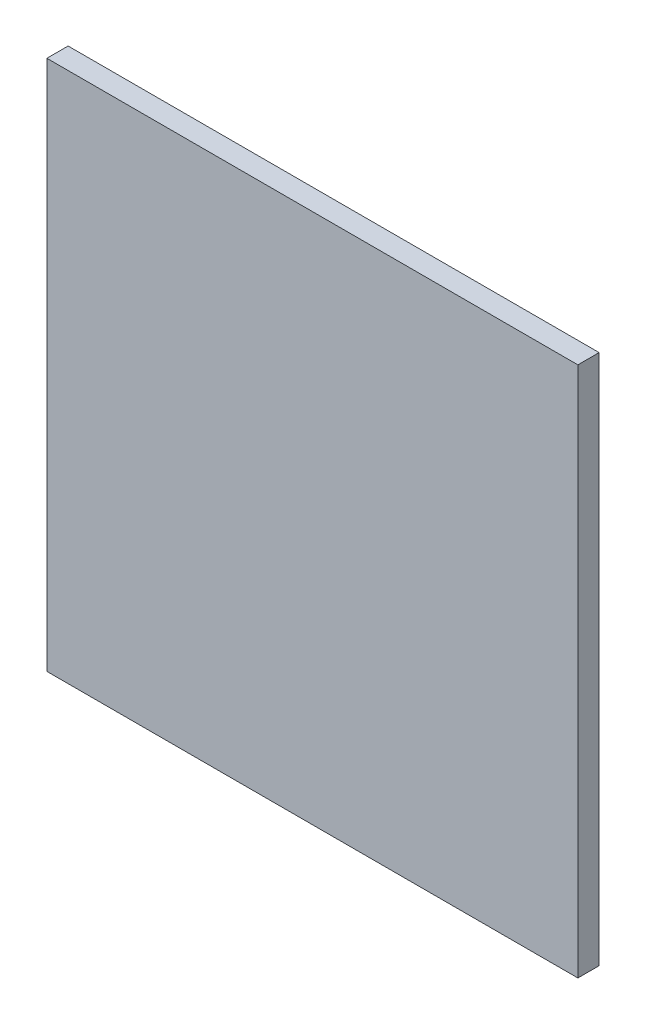
ISO-10303-21;
HEADER;
FILE_DESCRIPTION(('STEP AP214'),'2;1');
FILE_NAME('part.step','',(''),(''),'','','');
FILE_SCHEMA(('AUTOMOTIVE_DESIGN { 1 0 10303 214 1 1 1 1 }'));
ENDSEC;
DATA;
#1=APPLICATION_CONTEXT('core data for automotive mechanical design processes');
#2=APPLICATION_PROTOCOL_DEFINITION('international standard','automotive_design',2000,#1);
#3=PRODUCT_CONTEXT('',#1,'mechanical');
#4=PRODUCT('Part','Part','',(#3));
#5=PRODUCT_RELATED_PRODUCT_CATEGORY('part','',(#4));
#6=PRODUCT_DEFINITION_FORMATION('','',#4);
#7=PRODUCT_DEFINITION_CONTEXT('part definition',#1,'design');
#8=PRODUCT_DEFINITION('design','',#6,#7);
#9=PRODUCT_DEFINITION_SHAPE('','',#8);
#10=(LENGTH_UNIT() NAMED_UNIT(*) SI_UNIT(.MILLI.,.METRE.));
#11=(NAMED_UNIT(*) PLANE_ANGLE_UNIT() SI_UNIT($,.RADIAN.));
#12=(NAMED_UNIT(*) SI_UNIT($,.STERADIAN.) SOLID_ANGLE_UNIT());
#13=UNCERTAINTY_MEASURE_WITH_UNIT(LENGTH_MEASURE(1.E-05),#10,'distance_accuracy_value','');
#14=(GEOMETRIC_REPRESENTATION_CONTEXT(3) GLOBAL_UNCERTAINTY_ASSIGNED_CONTEXT((#13)) GLOBAL_UNIT_ASSIGNED_CONTEXT((#10,
#11,#12)) REPRESENTATION_CONTEXT('',''));
#15=CARTESIAN_POINT('',(0.,0.,0.));
#16=DIRECTION('',(0.,0.,1.));
#17=DIRECTION('',(1.,0.,0.));
#18=AXIS2_PLACEMENT_3D('',#15,#16,#17);
#19=CARTESIAN_POINT('',(0.,0.,1.016));
#20=DIRECTION('',(1.,0.,0.));
#21=DIRECTION('',(0.,1.,0.));
#22=AXIS2_PLACEMENT_3D('',#19,#20,#21);
#23=PLANE('',#22);
#24=DIRECTION('',(0.,-1.,0.));
#25=VECTOR('',#24,1.);
#26=CARTESIAN_POINT('',(0.,0.,0.));
#27=LINE('',#26,#25);
#28=CARTESIAN_POINT('',(0.,25.4,0.));
#29=VERTEX_POINT('',#28);
#30=CARTESIAN_POINT('',(0.,0.,0.));
#31=VERTEX_POINT('',#30);
#32=EDGE_CURVE('E97',#29,#31,#27,.T.);
#33=ORIENTED_EDGE('',*,*,#32,.T.);
#34=DIRECTION('',(0.,0.,-1.));
#35=VECTOR('',#34,1.);
#36=CARTESIAN_POINT('',(0.,0.,1.016));
#37=LINE('',#36,#35);
#38=CARTESIAN_POINT('',(0.,0.,1.016));
#39=VERTEX_POINT('',#38);
#40=EDGE_CURVE('E11',#39,#31,#37,.T.);
#41=ORIENTED_EDGE('',*,*,#40,.F.);
#42=DIRECTION('',(0.,-1.,0.));
#43=VECTOR('',#42,1.);
#44=CARTESIAN_POINT('',(0.,0.,1.016));
#45=LINE('',#44,#43);
#46=CARTESIAN_POINT('',(0.,25.4,1.016));
#47=VERTEX_POINT('',#46);
#48=EDGE_CURVE('E85',#47,#39,#45,.T.);
#49=ORIENTED_EDGE('',*,*,#48,.F.);
#50=DIRECTION('',(0.,0.,-1.));
#51=VECTOR('',#50,1.);
#52=CARTESIAN_POINT('',(0.,25.4,1.016));
#53=LINE('',#52,#51);
#54=EDGE_CURVE('E93',#47,#29,#53,.T.);
#55=ORIENTED_EDGE('',*,*,#54,.T.);
#56=EDGE_LOOP('',(#33,#41,#49,#55));
#57=FACE_BOUND('',#56,.T.);
#58=ADVANCED_FACE('F34',(#57),#23,.F.);
#59=CARTESIAN_POINT('',(0.,0.,1.016));
#60=DIRECTION('',(0.,1.,0.));
#61=DIRECTION('',(0.,0.,1.));
#62=AXIS2_PLACEMENT_3D('',#59,#60,#61);
#63=PLANE('',#62);
#64=DIRECTION('',(1.,0.,0.));
#65=VECTOR('',#64,1.);
#66=CARTESIAN_POINT('',(0.,0.,0.));
#67=LINE('',#66,#65);
#68=CARTESIAN_POINT('',(25.4,0.,0.));
#69=VERTEX_POINT('',#68);
#70=EDGE_CURVE('E89',#31,#69,#67,.T.);
#71=ORIENTED_EDGE('',*,*,#70,.T.);
#72=DIRECTION('',(0.,0.,-1.));
#73=VECTOR('',#72,1.);
#74=CARTESIAN_POINT('',(25.4,0.,1.016));
#75=LINE('',#74,#73);
#76=CARTESIAN_POINT('',(25.4,0.,1.016));
#77=VERTEX_POINT('',#76);
#78=EDGE_CURVE('E42',#77,#69,#75,.T.);
#79=ORIENTED_EDGE('',*,*,#78,.F.);
#80=DIRECTION('',(1.,0.,0.));
#81=VECTOR('',#80,1.);
#82=CARTESIAN_POINT('',(0.,0.,1.016));
#83=LINE('',#82,#81);
#84=EDGE_CURVE('E80',#39,#77,#83,.T.);
#85=ORIENTED_EDGE('',*,*,#84,.F.);
#86=ORIENTED_EDGE('',*,*,#40,.T.);
#87=EDGE_LOOP('',(#71,#79,#85,#86));
#88=FACE_BOUND('',#87,.T.);
#89=ADVANCED_FACE('F88',(#88),#63,.F.);
#90=CARTESIAN_POINT('',(25.4,0.,1.016));
#91=DIRECTION('',(-1.,0.,0.));
#92=DIRECTION('',(0.,-1.,0.));
#93=AXIS2_PLACEMENT_3D('',#90,#91,#92);
#94=PLANE('',#93);
#95=DIRECTION('',(0.,1.,0.));
#96=VECTOR('',#95,1.);
#97=CARTESIAN_POINT('',(25.4,0.,0.));
#98=LINE('',#97,#96);
#99=CARTESIAN_POINT('',(25.4,25.4,0.));
#100=VERTEX_POINT('',#99);
#101=EDGE_CURVE('E67',#69,#100,#98,.T.);
#102=ORIENTED_EDGE('',*,*,#101,.T.);
#103=DIRECTION('',(0.,0.,-1.));
#104=VECTOR('',#103,1.);
#105=CARTESIAN_POINT('',(25.4,25.4,1.016));
#106=LINE('',#105,#104);
#107=CARTESIAN_POINT('',(25.4,25.4,1.016));
#108=VERTEX_POINT('',#107);
#109=EDGE_CURVE('E90',#108,#100,#106,.T.);
#110=ORIENTED_EDGE('',*,*,#109,.F.);
#111=DIRECTION('',(0.,1.,0.));
#112=VECTOR('',#111,1.);
#113=CARTESIAN_POINT('',(25.4,0.,1.016));
#114=LINE('',#113,#112);
#115=EDGE_CURVE('E83',#77,#108,#114,.T.);
#116=ORIENTED_EDGE('',*,*,#115,.F.);
#117=ORIENTED_EDGE('',*,*,#78,.T.);
#118=EDGE_LOOP('',(#102,#110,#116,#117));
#119=FACE_BOUND('',#118,.T.);
#120=ADVANCED_FACE('F91',(#119),#94,.F.);
#121=CARTESIAN_POINT('',(0.,25.4,1.016));
#122=DIRECTION('',(0.,-1.,0.));
#123=DIRECTION('',(0.,0.,-1.));
#124=AXIS2_PLACEMENT_3D('',#121,#122,#123);
#125=PLANE('',#124);
#126=DIRECTION('',(-1.,0.,0.));
#127=VECTOR('',#126,1.);
#128=CARTESIAN_POINT('',(0.,25.4,0.));
#129=LINE('',#128,#127);
#130=EDGE_CURVE('E73',#100,#29,#129,.T.);
#131=ORIENTED_EDGE('',*,*,#130,.T.);
#132=ORIENTED_EDGE('',*,*,#54,.F.);
#133=DIRECTION('',(-1.,0.,0.));
#134=VECTOR('',#133,1.);
#135=CARTESIAN_POINT('',(0.,25.4,1.016));
#136=LINE('',#135,#134);
#137=EDGE_CURVE('E50',#108,#47,#136,.T.);
#138=ORIENTED_EDGE('',*,*,#137,.F.);
#139=ORIENTED_EDGE('',*,*,#109,.T.);
#140=EDGE_LOOP('',(#131,#132,#138,#139));
#141=FACE_BOUND('',#140,.T.);
#142=ADVANCED_FACE('F104',(#141),#125,.F.);
#143=CARTESIAN_POINT('',(0.,0.,1.016));
#144=DIRECTION('',(0.,0.,-1.));
#145=DIRECTION('',(-1.,0.,0.));
#146=AXIS2_PLACEMENT_3D('',#143,#144,#145);
#147=PLANE('',#146);
#148=ORIENTED_EDGE('',*,*,#48,.T.);
#149=ORIENTED_EDGE('',*,*,#84,.T.);
#150=ORIENTED_EDGE('',*,*,#115,.T.);
#151=ORIENTED_EDGE('',*,*,#137,.T.);
#152=EDGE_LOOP('',(#148,#149,#150,#151));
#153=FACE_BOUND('',#152,.T.);
#154=ADVANCED_FACE('F81',(#153),#147,.F.);
#155=CARTESIAN_POINT('',(0.,0.,0.));
#156=DIRECTION('',(0.,0.,-1.));
#157=DIRECTION('',(-1.,0.,0.));
#158=AXIS2_PLACEMENT_3D('',#155,#156,#157);
#159=PLANE('',#158);
#160=ORIENTED_EDGE('',*,*,#32,.F.);
#161=ORIENTED_EDGE('',*,*,#130,.F.);
#162=ORIENTED_EDGE('',*,*,#101,.F.);
#163=ORIENTED_EDGE('',*,*,#70,.F.);
#164=EDGE_LOOP('',(#160,#161,#162,#163));
#165=FACE_BOUND('',#164,.T.);
#166=ADVANCED_FACE('F107',(#165),#159,.T.);
#167=CLOSED_SHELL('',(#58,#89,#120,#142,#154,#166));
#168=MANIFOLD_SOLID_BREP('B2',#167);
#169=ADVANCED_BREP_SHAPE_REPRESENTATION('',(#18,#168),#14);
#170=SHAPE_DEFINITION_REPRESENTATION(#9,#169);
ENDSEC;
END-ISO-10303-21;
